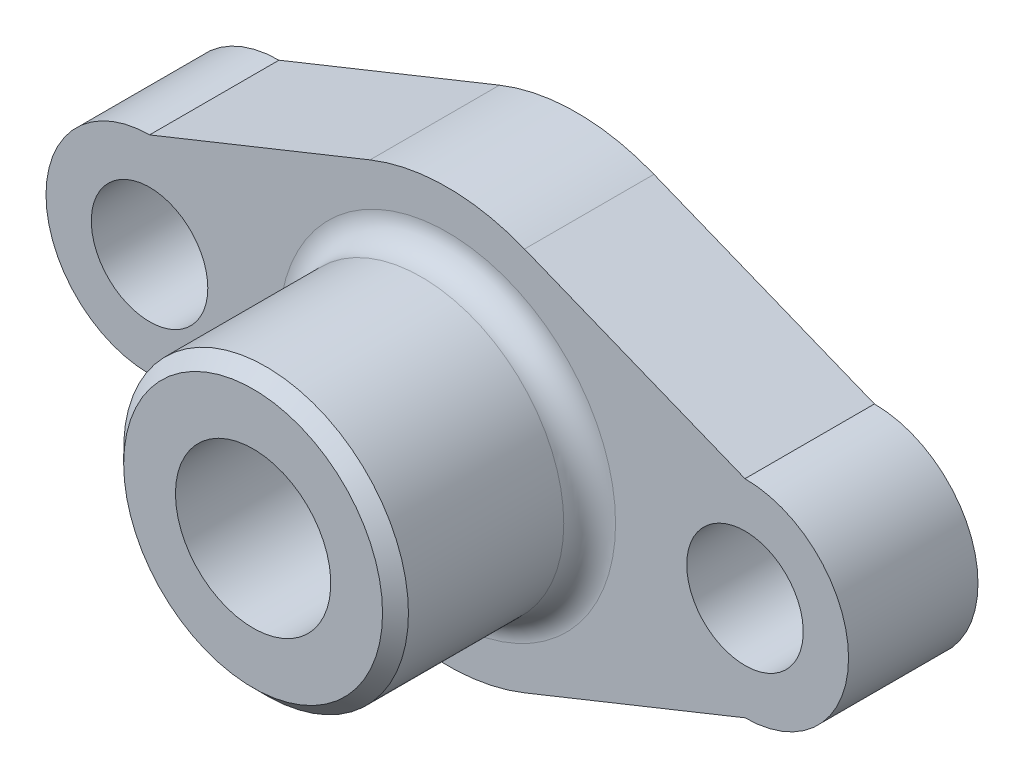
ISO-10303-21;
HEADER;
FILE_DESCRIPTION(('STEP AP214'),'2;1');
FILE_NAME('part.step','',(''),(''),'','','');
FILE_SCHEMA(('AUTOMOTIVE_DESIGN { 1 0 10303 214 1 1 1 1 }'));
ENDSEC;
DATA;
#1=APPLICATION_CONTEXT('core data for automotive mechanical design processes');
#2=APPLICATION_PROTOCOL_DEFINITION('international standard','automotive_design',2000,#1);
#3=PRODUCT_CONTEXT('',#1,'mechanical');
#4=PRODUCT('Part','Part','',(#3));
#5=PRODUCT_RELATED_PRODUCT_CATEGORY('part','',(#4));
#6=PRODUCT_DEFINITION_FORMATION('','',#4);
#7=PRODUCT_DEFINITION_CONTEXT('part definition',#1,'design');
#8=PRODUCT_DEFINITION('design','',#6,#7);
#9=PRODUCT_DEFINITION_SHAPE('','',#8);
#10=(LENGTH_UNIT() NAMED_UNIT(*) SI_UNIT(.MILLI.,.METRE.));
#11=(NAMED_UNIT(*) PLANE_ANGLE_UNIT() SI_UNIT($,.RADIAN.));
#12=(NAMED_UNIT(*) SI_UNIT($,.STERADIAN.) SOLID_ANGLE_UNIT());
#13=UNCERTAINTY_MEASURE_WITH_UNIT(LENGTH_MEASURE(1.E-05),#10,'distance_accuracy_value','');
#14=(GEOMETRIC_REPRESENTATION_CONTEXT(3) GLOBAL_UNCERTAINTY_ASSIGNED_CONTEXT((#13)) GLOBAL_UNIT_ASSIGNED_CONTEXT((#10,
#11,#12)) REPRESENTATION_CONTEXT('',''));
#15=CARTESIAN_POINT('',(0.,0.,0.));
#16=DIRECTION('',(0.,0.,1.));
#17=DIRECTION('',(1.,0.,0.));
#18=AXIS2_PLACEMENT_3D('',#15,#16,#17);
#19=CARTESIAN_POINT('',(0.,0.,10.));
#20=DIRECTION('',(0.,0.,1.));
#21=DIRECTION('',(1.,0.,0.));
#22=AXIS2_PLACEMENT_3D('',#19,#20,#21);
#23=PLANE('',#22);
#24=CARTESIAN_POINT('',(0.,0.,10.));
#25=DIRECTION('',(0.,0.,1.));
#26=DIRECTION('',(1.,0.,0.));
#27=AXIS2_PLACEMENT_3D('',#24,#25,#26);
#28=CIRCLE('',#27,13.);
#29=CARTESIAN_POINT('',(13.,0.,10.));
#30=VERTEX_POINT('',#29);
#31=EDGE_CURVE('E170',#30,#30,#28,.F.);
#32=ORIENTED_EDGE('',*,*,#31,.T.);
#33=EDGE_LOOP('',(#32));
#34=FACE_BOUND('',#33,.T.);
#35=CARTESIAN_POINT('',(-23.,0.,10.));
#36=DIRECTION('',(0.,0.,1.));
#37=DIRECTION('',(1.,0.,0.));
#38=AXIS2_PLACEMENT_3D('',#35,#36,#37);
#39=CIRCLE('',#38,4.49999999999999);
#40=CARTESIAN_POINT('',(-18.5,0.,10.));
#41=VERTEX_POINT('',#40);
#42=EDGE_CURVE('E144',#41,#41,#39,.T.);
#43=ORIENTED_EDGE('',*,*,#42,.F.);
#44=EDGE_LOOP('',(#43));
#45=FACE_BOUND('',#44,.T.);
#46=CARTESIAN_POINT('',(0.,0.,10.));
#47=DIRECTION('',(0.,0.,1.));
#48=DIRECTION('',(1.,0.,0.));
#49=AXIS2_PLACEMENT_3D('',#46,#47,#48);
#50=CIRCLE('',#49,16.);
#51=CARTESIAN_POINT('',(5.96666501165635,14.845838091488,10.));
#52=VERTEX_POINT('',#51);
#53=CARTESIAN_POINT('',(-5.96666501165635,14.845838091488,10.));
#54=VERTEX_POINT('',#53);
#55=EDGE_CURVE('E155',#52,#54,#50,.T.);
#56=ORIENTED_EDGE('',*,*,#55,.T.);
#57=DIRECTION('',(-0.927864880718,-0.372916563228522,0.));
#58=VECTOR('',#57,1.);
#59=CARTESIAN_POINT('',(-23.,8.,10.));
#60=LINE('',#59,#58);
#61=CARTESIAN_POINT('',(-23.,8.,10.));
#62=VERTEX_POINT('',#61);
#63=EDGE_CURVE('E103',#54,#62,#60,.T.);
#64=ORIENTED_EDGE('',*,*,#63,.T.);
#65=CARTESIAN_POINT('',(-23.,0.,10.));
#66=DIRECTION('',(0.,0.,1.));
#67=DIRECTION('',(1.,0.,0.));
#68=AXIS2_PLACEMENT_3D('',#65,#66,#67);
#69=CIRCLE('',#68,8.);
#70=CARTESIAN_POINT('',(-23.,-8.,10.));
#71=VERTEX_POINT('',#70);
#72=EDGE_CURVE('E240',#62,#71,#69,.T.);
#73=ORIENTED_EDGE('',*,*,#72,.T.);
#74=DIRECTION('',(0.927864880718,-0.372916563228522,0.));
#75=VECTOR('',#74,1.);
#76=CARTESIAN_POINT('',(-23.,-8.,10.));
#77=LINE('',#76,#75);
#78=CARTESIAN_POINT('',(-5.96666501165635,-14.845838091488,10.));
#79=VERTEX_POINT('',#78);
#80=EDGE_CURVE('E242',#71,#79,#77,.T.);
#81=ORIENTED_EDGE('',*,*,#80,.T.);
#82=CARTESIAN_POINT('',(0.,0.,10.));
#83=DIRECTION('',(0.,0.,1.));
#84=DIRECTION('',(1.,0.,0.));
#85=AXIS2_PLACEMENT_3D('',#82,#83,#84);
#86=CIRCLE('',#85,16.);
#87=CARTESIAN_POINT('',(5.96666501165635,-14.845838091488,10.));
#88=VERTEX_POINT('',#87);
#89=EDGE_CURVE('E122',#79,#88,#86,.T.);
#90=ORIENTED_EDGE('',*,*,#89,.T.);
#91=DIRECTION('',(0.927864880718,0.372916563228522,0.));
#92=VECTOR('',#91,1.);
#93=CARTESIAN_POINT('',(23.,-8.,10.));
#94=LINE('',#93,#92);
#95=CARTESIAN_POINT('',(23.,-8.,10.));
#96=VERTEX_POINT('',#95);
#97=EDGE_CURVE('E116',#88,#96,#94,.T.);
#98=ORIENTED_EDGE('',*,*,#97,.T.);
#99=CARTESIAN_POINT('',(23.,0.,10.));
#100=DIRECTION('',(0.,0.,1.));
#101=DIRECTION('',(-1.,0.,0.));
#102=AXIS2_PLACEMENT_3D('',#99,#100,#101);
#103=CIRCLE('',#102,8.);
#104=CARTESIAN_POINT('',(23.,8.,10.));
#105=VERTEX_POINT('',#104);
#106=EDGE_CURVE('E120',#96,#105,#103,.T.);
#107=ORIENTED_EDGE('',*,*,#106,.T.);
#108=DIRECTION('',(-0.927864880718,0.372916563228522,0.));
#109=VECTOR('',#108,1.);
#110=CARTESIAN_POINT('',(23.,8.,10.));
#111=LINE('',#110,#109);
#112=EDGE_CURVE('E59',#105,#52,#111,.T.);
#113=ORIENTED_EDGE('',*,*,#112,.T.);
#114=EDGE_LOOP('',(#56,#64,#73,#81,#90,#98,#107,#113));
#115=FACE_BOUND('',#114,.T.);
#116=CARTESIAN_POINT('',(23.,0.,10.));
#117=DIRECTION('',(0.,0.,1.));
#118=DIRECTION('',(-1.,0.,0.));
#119=AXIS2_PLACEMENT_3D('',#116,#117,#118);
#120=CIRCLE('',#119,4.49999999999999);
#121=CARTESIAN_POINT('',(18.5,0.,10.));
#122=VERTEX_POINT('',#121);
#123=EDGE_CURVE('E251',#122,#122,#120,.T.);
#124=ORIENTED_EDGE('',*,*,#123,.F.);
#125=EDGE_LOOP('',(#124));
#126=FACE_BOUND('',#125,.T.);
#127=ADVANCED_FACE('F41',(#34,#45,#115,#126),#23,.T.);
#128=CARTESIAN_POINT('',(0.,0.,0.));
#129=DIRECTION('',(0.,0.,1.));
#130=DIRECTION('',(1.,0.,0.));
#131=AXIS2_PLACEMENT_3D('',#128,#129,#130);
#132=PLANE('',#131);
#133=CARTESIAN_POINT('',(0.,0.,0.));
#134=DIRECTION('',(0.,0.,-1.));
#135=DIRECTION('',(-1.,0.,0.));
#136=AXIS2_PLACEMENT_3D('',#133,#134,#135);
#137=CIRCLE('',#136,9.99999999999999);
#138=CARTESIAN_POINT('',(-9.99999999999999,0.,0.));
#139=VERTEX_POINT('',#138);
#140=EDGE_CURVE('E257',#139,#139,#137,.T.);
#141=ORIENTED_EDGE('',*,*,#140,.F.);
#142=EDGE_LOOP('',(#141));
#143=FACE_BOUND('',#142,.T.);
#144=CARTESIAN_POINT('',(0.,0.,0.));
#145=DIRECTION('',(0.,0.,1.));
#146=DIRECTION('',(1.,0.,0.));
#147=AXIS2_PLACEMENT_3D('',#144,#145,#146);
#148=CIRCLE('',#147,16.);
#149=CARTESIAN_POINT('',(5.96666501165635,14.845838091488,0.));
#150=VERTEX_POINT('',#149);
#151=CARTESIAN_POINT('',(-5.96666501165635,14.845838091488,0.));
#152=VERTEX_POINT('',#151);
#153=EDGE_CURVE('E140',#150,#152,#148,.T.);
#154=ORIENTED_EDGE('',*,*,#153,.F.);
#155=DIRECTION('',(-0.927864880718,0.372916563228522,0.));
#156=VECTOR('',#155,1.);
#157=CARTESIAN_POINT('',(23.,8.,0.));
#158=LINE('',#157,#156);
#159=CARTESIAN_POINT('',(23.,8.,0.));
#160=VERTEX_POINT('',#159);
#161=EDGE_CURVE('E94',#160,#150,#158,.T.);
#162=ORIENTED_EDGE('',*,*,#161,.F.);
#163=CARTESIAN_POINT('',(23.,0.,0.));
#164=DIRECTION('',(0.,0.,1.));
#165=DIRECTION('',(-1.,0.,0.));
#166=AXIS2_PLACEMENT_3D('',#163,#164,#165);
#167=CIRCLE('',#166,8.);
#168=CARTESIAN_POINT('',(23.,-8.,0.));
#169=VERTEX_POINT('',#168);
#170=EDGE_CURVE('E88',#169,#160,#167,.T.);
#171=ORIENTED_EDGE('',*,*,#170,.F.);
#172=DIRECTION('',(0.927864880718,0.372916563228522,0.));
#173=VECTOR('',#172,1.);
#174=CARTESIAN_POINT('',(23.,-8.,0.));
#175=LINE('',#174,#173);
#176=CARTESIAN_POINT('',(5.96666501165635,-14.845838091488,0.));
#177=VERTEX_POINT('',#176);
#178=EDGE_CURVE('E130',#177,#169,#175,.T.);
#179=ORIENTED_EDGE('',*,*,#178,.F.);
#180=CARTESIAN_POINT('',(0.,0.,0.));
#181=DIRECTION('',(0.,0.,1.));
#182=DIRECTION('',(1.,0.,0.));
#183=AXIS2_PLACEMENT_3D('',#180,#181,#182);
#184=CIRCLE('',#183,16.);
#185=CARTESIAN_POINT('',(-5.96666501165635,-14.845838091488,0.));
#186=VERTEX_POINT('',#185);
#187=EDGE_CURVE('E150',#186,#177,#184,.T.);
#188=ORIENTED_EDGE('',*,*,#187,.F.);
#189=DIRECTION('',(0.927864880718,-0.372916563228522,0.));
#190=VECTOR('',#189,1.);
#191=CARTESIAN_POINT('',(-23.,-8.,0.));
#192=LINE('',#191,#190);
#193=CARTESIAN_POINT('',(-23.,-8.,0.));
#194=VERTEX_POINT('',#193);
#195=EDGE_CURVE('E148',#194,#186,#192,.T.);
#196=ORIENTED_EDGE('',*,*,#195,.F.);
#197=CARTESIAN_POINT('',(-23.,0.,0.));
#198=DIRECTION('',(0.,0.,1.));
#199=DIRECTION('',(1.,0.,0.));
#200=AXIS2_PLACEMENT_3D('',#197,#198,#199);
#201=CIRCLE('',#200,8.);
#202=CARTESIAN_POINT('',(-23.,8.,0.));
#203=VERTEX_POINT('',#202);
#204=EDGE_CURVE('E146',#203,#194,#201,.T.);
#205=ORIENTED_EDGE('',*,*,#204,.F.);
#206=DIRECTION('',(-0.927864880718,-0.372916563228522,0.));
#207=VECTOR('',#206,1.);
#208=CARTESIAN_POINT('',(-23.,8.,0.));
#209=LINE('',#208,#207);
#210=EDGE_CURVE('E143',#152,#203,#209,.T.);
#211=ORIENTED_EDGE('',*,*,#210,.F.);
#212=EDGE_LOOP('',(#154,#162,#171,#179,#188,#196,#205,#211));
#213=FACE_BOUND('',#212,.T.);
#214=CARTESIAN_POINT('',(-23.,0.,0.));
#215=DIRECTION('',(0.,0.,1.));
#216=DIRECTION('',(1.,0.,0.));
#217=AXIS2_PLACEMENT_3D('',#214,#215,#216);
#218=CIRCLE('',#217,4.49999999999999);
#219=CARTESIAN_POINT('',(-18.5,0.,0.));
#220=VERTEX_POINT('',#219);
#221=EDGE_CURVE('E248',#220,#220,#218,.T.);
#222=ORIENTED_EDGE('',*,*,#221,.T.);
#223=EDGE_LOOP('',(#222));
#224=FACE_BOUND('',#223,.T.);
#225=CARTESIAN_POINT('',(23.,0.,0.));
#226=DIRECTION('',(0.,0.,1.));
#227=DIRECTION('',(-1.,0.,0.));
#228=AXIS2_PLACEMENT_3D('',#225,#226,#227);
#229=CIRCLE('',#228,4.49999999999999);
#230=CARTESIAN_POINT('',(18.5,0.,0.));
#231=VERTEX_POINT('',#230);
#232=EDGE_CURVE('E254',#231,#231,#229,.T.);
#233=ORIENTED_EDGE('',*,*,#232,.T.);
#234=EDGE_LOOP('',(#233));
#235=FACE_BOUND('',#234,.T.);
#236=ADVANCED_FACE('F191',(#143,#213,#224,#235),#132,.F.);
#237=CARTESIAN_POINT('',(0.,0.,10.));
#238=DIRECTION('',(0.,0.,-1.));
#239=DIRECTION('',(-1.,0.,0.));
#240=AXIS2_PLACEMENT_3D('',#237,#238,#239);
#241=CYLINDRICAL_SURFACE('',#240,16.);
#242=ORIENTED_EDGE('',*,*,#153,.T.);
#243=DIRECTION('',(0.,0.,-1.));
#244=VECTOR('',#243,1.);
#245=CARTESIAN_POINT('',(-5.96666501165635,14.845838091488,10.));
#246=LINE('',#245,#244);
#247=EDGE_CURVE('E168',#54,#152,#246,.T.);
#248=ORIENTED_EDGE('',*,*,#247,.F.);
#249=ORIENTED_EDGE('',*,*,#55,.F.);
#250=DIRECTION('',(0.,0.,-1.));
#251=VECTOR('',#250,1.);
#252=CARTESIAN_POINT('',(5.96666501165635,14.845838091488,10.));
#253=LINE('',#252,#251);
#254=EDGE_CURVE('E136',#52,#150,#253,.T.);
#255=ORIENTED_EDGE('',*,*,#254,.T.);
#256=EDGE_LOOP('',(#242,#248,#249,#255));
#257=FACE_BOUND('',#256,.T.);
#258=ADVANCED_FACE('F197',(#257),#241,.T.);
#259=CARTESIAN_POINT('',(-23.,8.,10.));
#260=DIRECTION('',(0.372916563228522,-0.927864880718,0.));
#261=DIRECTION('',(0.927864880718,0.372916563228522,0.));
#262=AXIS2_PLACEMENT_3D('',#259,#260,#261);
#263=PLANE('',#262);
#264=ORIENTED_EDGE('',*,*,#210,.T.);
#265=DIRECTION('',(0.,0.,-1.));
#266=VECTOR('',#265,1.);
#267=CARTESIAN_POINT('',(-23.,8.,10.));
#268=LINE('',#267,#266);
#269=EDGE_CURVE('E165',#62,#203,#268,.T.);
#270=ORIENTED_EDGE('',*,*,#269,.F.);
#271=ORIENTED_EDGE('',*,*,#63,.F.);
#272=ORIENTED_EDGE('',*,*,#247,.T.);
#273=EDGE_LOOP('',(#264,#270,#271,#272));
#274=FACE_BOUND('',#273,.T.);
#275=ADVANCED_FACE('F223',(#274),#263,.F.);
#276=CARTESIAN_POINT('',(-23.,0.,10.));
#277=DIRECTION('',(0.,0.,-1.));
#278=DIRECTION('',(-1.,0.,0.));
#279=AXIS2_PLACEMENT_3D('',#276,#277,#278);
#280=CYLINDRICAL_SURFACE('',#279,8.);
#281=ORIENTED_EDGE('',*,*,#204,.T.);
#282=DIRECTION('',(0.,0.,-1.));
#283=VECTOR('',#282,1.);
#284=CARTESIAN_POINT('',(-23.,-8.,10.));
#285=LINE('',#284,#283);
#286=EDGE_CURVE('E162',#71,#194,#285,.T.);
#287=ORIENTED_EDGE('',*,*,#286,.F.);
#288=ORIENTED_EDGE('',*,*,#72,.F.);
#289=ORIENTED_EDGE('',*,*,#269,.T.);
#290=EDGE_LOOP('',(#281,#287,#288,#289));
#291=FACE_BOUND('',#290,.T.);
#292=ADVANCED_FACE('F219',(#291),#280,.T.);
#293=CARTESIAN_POINT('',(-23.,-8.,10.));
#294=DIRECTION('',(0.372916563228522,0.927864880718,0.));
#295=DIRECTION('',(-0.927864880718,0.372916563228522,0.));
#296=AXIS2_PLACEMENT_3D('',#293,#294,#295);
#297=PLANE('',#296);
#298=ORIENTED_EDGE('',*,*,#195,.T.);
#299=DIRECTION('',(0.,0.,-1.));
#300=VECTOR('',#299,1.);
#301=CARTESIAN_POINT('',(-5.96666501165635,-14.845838091488,10.));
#302=LINE('',#301,#300);
#303=EDGE_CURVE('E159',#79,#186,#302,.T.);
#304=ORIENTED_EDGE('',*,*,#303,.F.);
#305=ORIENTED_EDGE('',*,*,#80,.F.);
#306=ORIENTED_EDGE('',*,*,#286,.T.);
#307=EDGE_LOOP('',(#298,#304,#305,#306));
#308=FACE_BOUND('',#307,.T.);
#309=ADVANCED_FACE('F215',(#308),#297,.F.);
#310=CARTESIAN_POINT('',(0.,0.,10.));
#311=DIRECTION('',(0.,0.,-1.));
#312=DIRECTION('',(-1.,0.,0.));
#313=AXIS2_PLACEMENT_3D('',#310,#311,#312);
#314=CYLINDRICAL_SURFACE('',#313,16.);
#315=ORIENTED_EDGE('',*,*,#187,.T.);
#316=DIRECTION('',(0.,0.,-1.));
#317=VECTOR('',#316,1.);
#318=CARTESIAN_POINT('',(5.96666501165635,-14.845838091488,10.));
#319=LINE('',#318,#317);
#320=EDGE_CURVE('E131',#88,#177,#319,.T.);
#321=ORIENTED_EDGE('',*,*,#320,.F.);
#322=ORIENTED_EDGE('',*,*,#89,.F.);
#323=ORIENTED_EDGE('',*,*,#303,.T.);
#324=EDGE_LOOP('',(#315,#321,#322,#323));
#325=FACE_BOUND('',#324,.T.);
#326=ADVANCED_FACE('F212',(#325),#314,.T.);
#327=CARTESIAN_POINT('',(23.,-8.,10.));
#328=DIRECTION('',(-0.372916563228522,0.927864880718,0.));
#329=DIRECTION('',(-0.927864880718,-0.372916563228522,0.));
#330=AXIS2_PLACEMENT_3D('',#327,#328,#329);
#331=PLANE('',#330);
#332=ORIENTED_EDGE('',*,*,#178,.T.);
#333=DIRECTION('',(0.,0.,-1.));
#334=VECTOR('',#333,1.);
#335=CARTESIAN_POINT('',(23.,-8.,10.));
#336=LINE('',#335,#334);
#337=EDGE_CURVE('E127',#96,#169,#336,.T.);
#338=ORIENTED_EDGE('',*,*,#337,.F.);
#339=ORIENTED_EDGE('',*,*,#97,.F.);
#340=ORIENTED_EDGE('',*,*,#320,.T.);
#341=EDGE_LOOP('',(#332,#338,#339,#340));
#342=FACE_BOUND('',#341,.T.);
#343=ADVANCED_FACE('F128',(#342),#331,.F.);
#344=CARTESIAN_POINT('',(23.,0.,10.));
#345=DIRECTION('',(0.,0.,-1.));
#346=DIRECTION('',(-1.,0.,0.));
#347=AXIS2_PLACEMENT_3D('',#344,#345,#346);
#348=CYLINDRICAL_SURFACE('',#347,8.);
#349=ORIENTED_EDGE('',*,*,#170,.T.);
#350=DIRECTION('',(0.,0.,-1.));
#351=VECTOR('',#350,1.);
#352=CARTESIAN_POINT('',(23.,8.,10.));
#353=LINE('',#352,#351);
#354=EDGE_CURVE('E132',#105,#160,#353,.T.);
#355=ORIENTED_EDGE('',*,*,#354,.F.);
#356=ORIENTED_EDGE('',*,*,#106,.F.);
#357=ORIENTED_EDGE('',*,*,#337,.T.);
#358=EDGE_LOOP('',(#349,#355,#356,#357));
#359=FACE_BOUND('',#358,.T.);
#360=ADVANCED_FACE('F134',(#359),#348,.T.);
#361=CARTESIAN_POINT('',(23.,8.,10.));
#362=DIRECTION('',(-0.372916563228522,-0.927864880718,0.));
#363=DIRECTION('',(0.927864880718,-0.372916563228522,0.));
#364=AXIS2_PLACEMENT_3D('',#361,#362,#363);
#365=PLANE('',#364);
#366=ORIENTED_EDGE('',*,*,#161,.T.);
#367=ORIENTED_EDGE('',*,*,#254,.F.);
#368=ORIENTED_EDGE('',*,*,#112,.F.);
#369=ORIENTED_EDGE('',*,*,#354,.T.);
#370=EDGE_LOOP('',(#366,#367,#368,#369));
#371=FACE_BOUND('',#370,.T.);
#372=ADVANCED_FACE('F205',(#371),#365,.F.);
#373=CARTESIAN_POINT('',(-23.,0.,10.));
#374=DIRECTION('',(0.,0.,-1.));
#375=DIRECTION('',(-1.,0.,0.));
#376=AXIS2_PLACEMENT_3D('',#373,#374,#375);
#377=CYLINDRICAL_SURFACE('',#376,4.49999999999999);
#378=ORIENTED_EDGE('',*,*,#42,.T.);
#379=EDGE_LOOP('',(#378));
#380=FACE_BOUND('',#379,.T.);
#381=ORIENTED_EDGE('',*,*,#221,.F.);
#382=EDGE_LOOP('',(#381));
#383=FACE_BOUND('',#382,.T.);
#384=ADVANCED_FACE('F202',(#380,#383),#377,.F.);
#385=CARTESIAN_POINT('',(23.,0.,10.));
#386=DIRECTION('',(0.,0.,-1.));
#387=DIRECTION('',(-1.,0.,0.));
#388=AXIS2_PLACEMENT_3D('',#385,#386,#387);
#389=CYLINDRICAL_SURFACE('',#388,4.49999999999999);
#390=ORIENTED_EDGE('',*,*,#123,.T.);
#391=EDGE_LOOP('',(#390));
#392=FACE_BOUND('',#391,.T.);
#393=ORIENTED_EDGE('',*,*,#232,.F.);
#394=EDGE_LOOP('',(#393));
#395=FACE_BOUND('',#394,.T.);
#396=ADVANCED_FACE('F304',(#392,#395),#389,.F.);
#397=CARTESIAN_POINT('',(0.,0.,25.));
#398=DIRECTION('',(0.,0.,-1.));
#399=DIRECTION('',(-1.,0.,0.));
#400=AXIS2_PLACEMENT_3D('',#397,#398,#399);
#401=CYLINDRICAL_SURFACE('',#400,11.);
#402=CARTESIAN_POINT('',(0.,0.,24.));
#403=DIRECTION('',(0.,0.,1.));
#404=DIRECTION('',(1.,0.,0.));
#405=AXIS2_PLACEMENT_3D('',#402,#403,#404);
#406=CIRCLE('',#405,11.);
#407=CARTESIAN_POINT('',(11.,0.,24.));
#408=VERTEX_POINT('',#407);
#409=EDGE_CURVE('E11',#408,#408,#406,.F.);
#410=ORIENTED_EDGE('',*,*,#409,.T.);
#411=EDGE_LOOP('',(#410));
#412=FACE_BOUND('',#411,.T.);
#413=CARTESIAN_POINT('',(0.,0.,12.));
#414=DIRECTION('',(0.,0.,1.));
#415=DIRECTION('',(1.,0.,0.));
#416=AXIS2_PLACEMENT_3D('',#413,#414,#415);
#417=CIRCLE('',#416,11.);
#418=CARTESIAN_POINT('',(11.,0.,12.));
#419=VERTEX_POINT('',#418);
#420=EDGE_CURVE('E173',#419,#419,#417,.T.);
#421=ORIENTED_EDGE('',*,*,#420,.T.);
#422=EDGE_LOOP('',(#421));
#423=FACE_BOUND('',#422,.T.);
#424=ADVANCED_FACE('F300',(#412,#423),#401,.T.);
#425=CARTESIAN_POINT('',(0.,0.,25.));
#426=DIRECTION('',(0.,0.,1.));
#427=DIRECTION('',(1.,0.,0.));
#428=AXIS2_PLACEMENT_3D('',#425,#426,#427);
#429=PLANE('',#428);
#430=CARTESIAN_POINT('',(0.,0.,25.));
#431=DIRECTION('',(0.,0.,1.));
#432=DIRECTION('',(1.,0.,0.));
#433=AXIS2_PLACEMENT_3D('',#430,#431,#432);
#434=CIRCLE('',#433,10.);
#435=CARTESIAN_POINT('',(10.,0.,25.));
#436=VERTEX_POINT('',#435);
#437=EDGE_CURVE('E51',#436,#436,#434,.T.);
#438=ORIENTED_EDGE('',*,*,#437,.T.);
#439=EDGE_LOOP('',(#438));
#440=FACE_BOUND('',#439,.T.);
#441=CARTESIAN_POINT('',(0.,0.,25.));
#442=DIRECTION('',(0.,0.,-1.));
#443=DIRECTION('',(-1.,0.,0.));
#444=AXIS2_PLACEMENT_3D('',#441,#442,#443);
#445=CIRCLE('',#444,5.99999999999999);
#446=CARTESIAN_POINT('',(-5.99999999999999,0.,25.));
#447=VERTEX_POINT('',#446);
#448=EDGE_CURVE('E271',#447,#447,#445,.T.);
#449=ORIENTED_EDGE('',*,*,#448,.T.);
#450=EDGE_LOOP('',(#449));
#451=FACE_BOUND('',#450,.T.);
#452=ADVANCED_FACE('F178',(#440,#451),#429,.T.);
#453=CARTESIAN_POINT('',(0.,0.,0.));
#454=DIRECTION('',(0.,0.,-1.));
#455=DIRECTION('',(-1.,0.,0.));
#456=AXIS2_PLACEMENT_3D('',#453,#454,#455);
#457=CONICAL_SURFACE('',#456,9.99999999999999,0.141897054604164);
#458=CARTESIAN_POINT('',(0.,0.,13.1414213562373));
#459=DIRECTION('',(0.,0.,-1.));
#460=DIRECTION('',(-1.,0.,0.));
#461=AXIS2_PLACEMENT_3D('',#458,#459,#460);
#462=CIRCLE('',#461,8.12265409196609);
#463=CARTESIAN_POINT('',(-8.12265409196609,0.,13.1414213562373));
#464=VERTEX_POINT('',#463);
#465=EDGE_CURVE('E262',#464,#464,#462,.T.);
#466=ORIENTED_EDGE('',*,*,#465,.F.);
#467=EDGE_LOOP('',(#466));
#468=FACE_BOUND('',#467,.T.);
#469=ORIENTED_EDGE('',*,*,#140,.T.);
#470=EDGE_LOOP('',(#469));
#471=FACE_BOUND('',#470,.T.);
#472=ADVANCED_FACE('F289',(#468,#471),#457,.F.);
#473=CARTESIAN_POINT('',(0.,0.,13.));
#474=DIRECTION('',(0.,0.,-1.));
#475=DIRECTION('',(-1.,0.,0.));
#476=AXIS2_PLACEMENT_3D('',#473,#474,#475);
#477=TOROIDAL_SURFACE('',#476,7.13270459830493,1.);
#478=CARTESIAN_POINT('',(0.,0.,14.));
#479=DIRECTION('',(0.,0.,-1.));
#480=DIRECTION('',(-1.,0.,0.));
#481=AXIS2_PLACEMENT_3D('',#478,#479,#480);
#482=CIRCLE('',#481,7.13270459830493);
#483=CARTESIAN_POINT('',(-7.13270459830493,0.,14.));
#484=VERTEX_POINT('',#483);
#485=EDGE_CURVE('E265',#484,#484,#482,.T.);
#486=ORIENTED_EDGE('',*,*,#485,.F.);
#487=EDGE_LOOP('',(#486));
#488=FACE_BOUND('',#487,.T.);
#489=ORIENTED_EDGE('',*,*,#465,.T.);
#490=EDGE_LOOP('',(#489));
#491=FACE_BOUND('',#490,.T.);
#492=ADVANCED_FACE('F283',(#488,#491),#477,.F.);
#493=CARTESIAN_POINT('',(-7.13270459830492,0.,14.));
#494=DIRECTION('',(0.,0.,1.));
#495=DIRECTION('',(1.,0.,0.));
#496=AXIS2_PLACEMENT_3D('',#493,#494,#495);
#497=PLANE('',#496);
#498=CARTESIAN_POINT('',(0.,0.,14.));
#499=DIRECTION('',(0.,0.,-1.));
#500=DIRECTION('',(-1.,0.,0.));
#501=AXIS2_PLACEMENT_3D('',#498,#499,#500);
#502=CIRCLE('',#501,5.99999999999999);
#503=CARTESIAN_POINT('',(-5.99999999999999,0.,14.));
#504=VERTEX_POINT('',#503);
#505=EDGE_CURVE('E268',#504,#504,#502,.T.);
#506=ORIENTED_EDGE('',*,*,#505,.F.);
#507=EDGE_LOOP('',(#506));
#508=FACE_BOUND('',#507,.T.);
#509=ORIENTED_EDGE('',*,*,#485,.T.);
#510=EDGE_LOOP('',(#509));
#511=FACE_BOUND('',#510,.T.);
#512=ADVANCED_FACE('F277',(#508,#511),#497,.F.);
#513=CARTESIAN_POINT('',(0.,0.,-38.345280775068));
#514=DIRECTION('',(0.,0.,-1.));
#515=DIRECTION('',(-1.,0.,0.));
#516=AXIS2_PLACEMENT_3D('',#513,#514,#515);
#517=CYLINDRICAL_SURFACE('',#516,5.99999999999999);
#518=ORIENTED_EDGE('',*,*,#448,.F.);
#519=EDGE_LOOP('',(#518));
#520=FACE_BOUND('',#519,.T.);
#521=ORIENTED_EDGE('',*,*,#505,.T.);
#522=EDGE_LOOP('',(#521));
#523=FACE_BOUND('',#522,.T.);
#524=ADVANCED_FACE('F187',(#520,#523),#517,.F.);
#525=CARTESIAN_POINT('',(0.,0.,12.));
#526=DIRECTION('',(0.,0.,1.));
#527=DIRECTION('',(1.,0.,0.));
#528=AXIS2_PLACEMENT_3D('',#525,#526,#527);
#529=TOROIDAL_SURFACE('',#528,13.,2.);
#530=ORIENTED_EDGE('',*,*,#420,.F.);
#531=EDGE_LOOP('',(#530));
#532=FACE_BOUND('',#531,.T.);
#533=ORIENTED_EDGE('',*,*,#31,.F.);
#534=EDGE_LOOP('',(#533));
#535=FACE_BOUND('',#534,.T.);
#536=ADVANCED_FACE('F182',(#532,#535),#529,.F.);
#537=CARTESIAN_POINT('',(0.,0.,25.));
#538=DIRECTION('',(0.,0.,-1.));
#539=DIRECTION('',(-1.,0.,0.));
#540=AXIS2_PLACEMENT_3D('',#537,#538,#539);
#541=CONICAL_SURFACE('',#540,10.,0.785398163397447);
#542=ORIENTED_EDGE('',*,*,#409,.F.);
#543=EDGE_LOOP('',(#542));
#544=FACE_BOUND('',#543,.T.);
#545=ORIENTED_EDGE('',*,*,#437,.F.);
#546=EDGE_LOOP('',(#545));
#547=FACE_BOUND('',#546,.T.);
#548=ADVANCED_FACE('F44',(#544,#547),#541,.T.);
#549=CLOSED_SHELL('',(#127,#236,#258,#275,#292,#309,#326,#343,#360,#372,#384,#396,#424,#452,
#472,#492,#512,#524,#536,#548));
#550=MANIFOLD_SOLID_BREP('B2',#549);
#551=ADVANCED_BREP_SHAPE_REPRESENTATION('',(#18,#550),#14);
#552=SHAPE_DEFINITION_REPRESENTATION(#9,#551);
ENDSEC;
END-ISO-10303-21;
